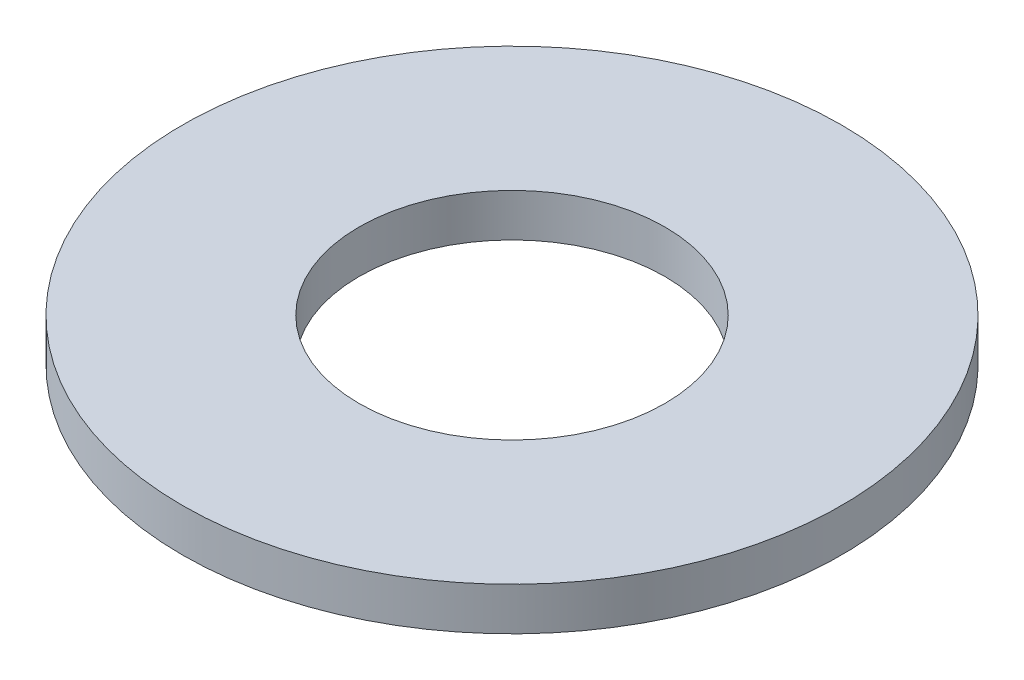
ISO-10303-21;
HEADER;
FILE_DESCRIPTION(('STEP AP214'),'2;1');
FILE_NAME('part.step','',(''),(''),'','','');
FILE_SCHEMA(('AUTOMOTIVE_DESIGN { 1 0 10303 214 1 1 1 1 }'));
ENDSEC;
DATA;
#1=APPLICATION_CONTEXT('core data for automotive mechanical design processes');
#2=APPLICATION_PROTOCOL_DEFINITION('international standard','automotive_design',2000,#1);
#3=PRODUCT_CONTEXT('',#1,'mechanical');
#4=PRODUCT('Part','Part','',(#3));
#5=PRODUCT_RELATED_PRODUCT_CATEGORY('part','',(#4));
#6=PRODUCT_DEFINITION_FORMATION('','',#4);
#7=PRODUCT_DEFINITION_CONTEXT('part definition',#1,'design');
#8=PRODUCT_DEFINITION('design','',#6,#7);
#9=PRODUCT_DEFINITION_SHAPE('','',#8);
#10=(LENGTH_UNIT() NAMED_UNIT(*) SI_UNIT(.MILLI.,.METRE.));
#11=(NAMED_UNIT(*) PLANE_ANGLE_UNIT() SI_UNIT($,.RADIAN.));
#12=(NAMED_UNIT(*) SI_UNIT($,.STERADIAN.) SOLID_ANGLE_UNIT());
#13=UNCERTAINTY_MEASURE_WITH_UNIT(LENGTH_MEASURE(1.E-05),#10,'distance_accuracy_value','');
#14=(GEOMETRIC_REPRESENTATION_CONTEXT(3) GLOBAL_UNCERTAINTY_ASSIGNED_CONTEXT((#13)) GLOBAL_UNIT_ASSIGNED_CONTEXT((#10,
#11,#12)) REPRESENTATION_CONTEXT('',''));
#15=CARTESIAN_POINT('',(0.,0.,0.));
#16=DIRECTION('',(0.,0.,1.));
#17=DIRECTION('',(1.,0.,0.));
#18=AXIS2_PLACEMENT_3D('',#15,#16,#17);
#19=CARTESIAN_POINT('',(0.,1.4478,0.));
#20=DIRECTION('',(0.,-1.,0.));
#21=DIRECTION('',(0.,0.,-1.));
#22=AXIS2_PLACEMENT_3D('',#19,#20,#21);
#23=CYLINDRICAL_SURFACE('',#22,11.1125);
#24=CARTESIAN_POINT('',(0.,1.4478,0.));
#25=DIRECTION('',(0.,1.,0.));
#26=DIRECTION('',(0.,0.,1.));
#27=AXIS2_PLACEMENT_3D('',#24,#25,#26);
#28=CIRCLE('',#27,11.1125);
#29=CARTESIAN_POINT('',(0.,1.4478,11.1125));
#30=VERTEX_POINT('',#29);
#31=EDGE_CURVE('E10',#30,#30,#28,.T.);
#32=ORIENTED_EDGE('',*,*,#31,.F.);
#33=EDGE_LOOP('',(#32));
#34=FACE_BOUND('',#33,.T.);
#35=CARTESIAN_POINT('',(0.,0.,0.));
#36=DIRECTION('',(0.,1.,0.));
#37=DIRECTION('',(0.,0.,1.));
#38=AXIS2_PLACEMENT_3D('',#35,#36,#37);
#39=CIRCLE('',#38,11.1125);
#40=CARTESIAN_POINT('',(0.,0.,11.1125));
#41=VERTEX_POINT('',#40);
#42=EDGE_CURVE('E35',#41,#41,#39,.T.);
#43=ORIENTED_EDGE('',*,*,#42,.T.);
#44=EDGE_LOOP('',(#43));
#45=FACE_BOUND('',#44,.T.);
#46=ADVANCED_FACE('F32',(#34,#45),#23,.T.);
#47=CARTESIAN_POINT('',(0.,1.4478,0.));
#48=DIRECTION('',(0.,1.,0.));
#49=DIRECTION('',(0.,0.,1.));
#50=AXIS2_PLACEMENT_3D('',#47,#48,#49);
#51=PLANE('',#50);
#52=CARTESIAN_POINT('',(0.,1.4478,0.));
#53=DIRECTION('',(0.,1.,0.));
#54=DIRECTION('',(0.,0.,1.));
#55=AXIS2_PLACEMENT_3D('',#52,#53,#54);
#56=CIRCLE('',#55,5.1562);
#57=CARTESIAN_POINT('',(0.,1.4478,5.1562));
#58=VERTEX_POINT('',#57);
#59=EDGE_CURVE('E44',#58,#58,#56,.T.);
#60=ORIENTED_EDGE('',*,*,#59,.F.);
#61=EDGE_LOOP('',(#60));
#62=FACE_BOUND('',#61,.T.);
#63=ORIENTED_EDGE('',*,*,#31,.T.);
#64=EDGE_LOOP('',(#63));
#65=FACE_BOUND('',#64,.T.);
#66=ADVANCED_FACE('F59',(#62,#65),#51,.T.);
#67=CARTESIAN_POINT('',(0.,0.,0.));
#68=DIRECTION('',(0.,1.,0.));
#69=DIRECTION('',(0.,0.,1.));
#70=AXIS2_PLACEMENT_3D('',#67,#68,#69);
#71=PLANE('',#70);
#72=CARTESIAN_POINT('',(0.,0.,0.));
#73=DIRECTION('',(0.,1.,0.));
#74=DIRECTION('',(0.,0.,1.));
#75=AXIS2_PLACEMENT_3D('',#72,#73,#74);
#76=CIRCLE('',#75,5.1562);
#77=CARTESIAN_POINT('',(0.,0.,5.1562));
#78=VERTEX_POINT('',#77);
#79=EDGE_CURVE('E42',#78,#78,#76,.T.);
#80=ORIENTED_EDGE('',*,*,#79,.T.);
#81=EDGE_LOOP('',(#80));
#82=FACE_BOUND('',#81,.T.);
#83=ORIENTED_EDGE('',*,*,#42,.F.);
#84=EDGE_LOOP('',(#83));
#85=FACE_BOUND('',#84,.T.);
#86=ADVANCED_FACE('F50',(#82,#85),#71,.F.);
#87=CARTESIAN_POINT('',(0.,0.,0.));
#88=DIRECTION('',(0.,1.,0.));
#89=DIRECTION('',(0.,0.,1.));
#90=AXIS2_PLACEMENT_3D('',#87,#88,#89);
#91=CYLINDRICAL_SURFACE('',#90,5.1562);
#92=ORIENTED_EDGE('',*,*,#79,.F.);
#93=EDGE_LOOP('',(#92));
#94=FACE_BOUND('',#93,.T.);
#95=ORIENTED_EDGE('',*,*,#59,.T.);
#96=EDGE_LOOP('',(#95));
#97=FACE_BOUND('',#96,.T.);
#98=ADVANCED_FACE('F53',(#94,#97),#91,.F.);
#99=CLOSED_SHELL('',(#46,#66,#86,#98));
#100=MANIFOLD_SOLID_BREP('B2',#99);
#101=ADVANCED_BREP_SHAPE_REPRESENTATION('',(#18,#100),#14);
#102=SHAPE_DEFINITION_REPRESENTATION(#9,#101);
ENDSEC;
END-ISO-10303-21;
